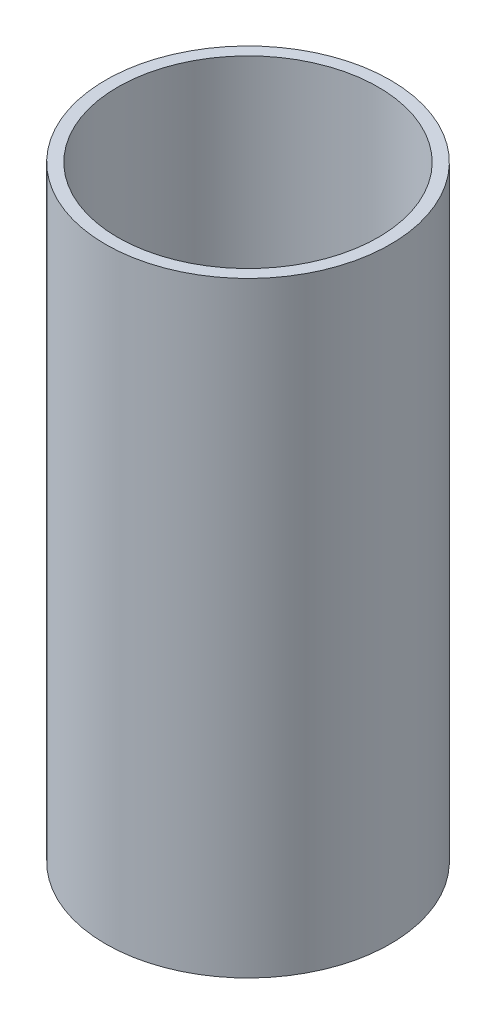
ISO-10303-21;
HEADER;
FILE_DESCRIPTION(('STEP AP214'),'2;1');
FILE_NAME('part.step','',(''),(''),'','','');
FILE_SCHEMA(('AUTOMOTIVE_DESIGN { 1 0 10303 214 1 1 1 1 }'));
ENDSEC;
DATA;
#1=APPLICATION_CONTEXT('core data for automotive mechanical design processes');
#2=APPLICATION_PROTOCOL_DEFINITION('international standard','automotive_design',2000,#1);
#3=PRODUCT_CONTEXT('',#1,'mechanical');
#4=PRODUCT('Part','Part','',(#3));
#5=PRODUCT_RELATED_PRODUCT_CATEGORY('part','',(#4));
#6=PRODUCT_DEFINITION_FORMATION('','',#4);
#7=PRODUCT_DEFINITION_CONTEXT('part definition',#1,'design');
#8=PRODUCT_DEFINITION('design','',#6,#7);
#9=PRODUCT_DEFINITION_SHAPE('','',#8);
#10=(LENGTH_UNIT() NAMED_UNIT(*) SI_UNIT(.MILLI.,.METRE.));
#11=(NAMED_UNIT(*) PLANE_ANGLE_UNIT() SI_UNIT($,.RADIAN.));
#12=(NAMED_UNIT(*) SI_UNIT($,.STERADIAN.) SOLID_ANGLE_UNIT());
#13=UNCERTAINTY_MEASURE_WITH_UNIT(LENGTH_MEASURE(1.E-05),#10,'distance_accuracy_value','');
#14=(GEOMETRIC_REPRESENTATION_CONTEXT(3) GLOBAL_UNCERTAINTY_ASSIGNED_CONTEXT((#13)) GLOBAL_UNIT_ASSIGNED_CONTEXT((#10,
#11,#12)) REPRESENTATION_CONTEXT('',''));
#15=CARTESIAN_POINT('',(0.,0.,0.));
#16=DIRECTION('',(0.,0.,1.));
#17=DIRECTION('',(1.,0.,0.));
#18=AXIS2_PLACEMENT_3D('',#15,#16,#17);
#19=CARTESIAN_POINT('',(0.,5.,0.));
#20=DIRECTION('',(0.,1.,0.));
#21=DIRECTION('',(0.,0.,1.));
#22=AXIS2_PLACEMENT_3D('',#19,#20,#21);
#23=PLANE('',#22);
#24=CARTESIAN_POINT('',(0.,5.,0.));
#25=DIRECTION('',(0.,1.,0.));
#26=DIRECTION('',(0.,0.,1.));
#27=AXIS2_PLACEMENT_3D('',#24,#25,#26);
#28=CIRCLE('',#27,2.35);
#29=CARTESIAN_POINT('',(0.,5.,2.35));
#30=VERTEX_POINT('',#29);
#31=EDGE_CURVE('E10',#30,#30,#28,.T.);
#32=ORIENTED_EDGE('',*,*,#31,.T.);
#33=EDGE_LOOP('',(#32));
#34=FACE_BOUND('',#33,.T.);
#35=CARTESIAN_POINT('',(0.,5.,0.));
#36=DIRECTION('',(0.,1.,0.));
#37=DIRECTION('',(0.,0.,1.));
#38=AXIS2_PLACEMENT_3D('',#35,#36,#37);
#39=CIRCLE('',#38,2.15);
#40=CARTESIAN_POINT('',(0.,5.,2.15));
#41=VERTEX_POINT('',#40);
#42=EDGE_CURVE('E50',#41,#41,#39,.T.);
#43=ORIENTED_EDGE('',*,*,#42,.F.);
#44=EDGE_LOOP('',(#43));
#45=FACE_BOUND('',#44,.T.);
#46=ADVANCED_FACE('F37',(#34,#45),#23,.T.);
#47=CARTESIAN_POINT('',(0.,-5.,0.));
#48=DIRECTION('',(0.,1.,0.));
#49=DIRECTION('',(0.,0.,1.));
#50=AXIS2_PLACEMENT_3D('',#47,#48,#49);
#51=PLANE('',#50);
#52=CARTESIAN_POINT('',(0.,-5.,0.));
#53=DIRECTION('',(0.,1.,0.));
#54=DIRECTION('',(0.,0.,1.));
#55=AXIS2_PLACEMENT_3D('',#52,#53,#54);
#56=CIRCLE('',#55,2.35);
#57=CARTESIAN_POINT('',(0.,-5.,2.35));
#58=VERTEX_POINT('',#57);
#59=EDGE_CURVE('E41',#58,#58,#56,.T.);
#60=ORIENTED_EDGE('',*,*,#59,.F.);
#61=EDGE_LOOP('',(#60));
#62=FACE_BOUND('',#61,.T.);
#63=CARTESIAN_POINT('',(0.,-5.,0.));
#64=DIRECTION('',(0.,1.,0.));
#65=DIRECTION('',(0.,0.,1.));
#66=AXIS2_PLACEMENT_3D('',#63,#64,#65);
#67=CIRCLE('',#66,2.15);
#68=CARTESIAN_POINT('',(0.,-5.,2.15));
#69=VERTEX_POINT('',#68);
#70=EDGE_CURVE('E52',#69,#69,#67,.T.);
#71=ORIENTED_EDGE('',*,*,#70,.T.);
#72=EDGE_LOOP('',(#71));
#73=FACE_BOUND('',#72,.T.);
#74=ADVANCED_FACE('F64',(#62,#73),#51,.F.);
#75=CARTESIAN_POINT('',(0.,5.,0.));
#76=DIRECTION('',(0.,-1.,0.));
#77=DIRECTION('',(0.,0.,-1.));
#78=AXIS2_PLACEMENT_3D('',#75,#76,#77);
#79=CYLINDRICAL_SURFACE('',#78,2.35);
#80=ORIENTED_EDGE('',*,*,#31,.F.);
#81=EDGE_LOOP('',(#80));
#82=FACE_BOUND('',#81,.T.);
#83=ORIENTED_EDGE('',*,*,#59,.T.);
#84=EDGE_LOOP('',(#83));
#85=FACE_BOUND('',#84,.T.);
#86=ADVANCED_FACE('F39',(#82,#85),#79,.T.);
#87=CARTESIAN_POINT('',(0.,5.,0.));
#88=DIRECTION('',(0.,-1.,0.));
#89=DIRECTION('',(0.,0.,-1.));
#90=AXIS2_PLACEMENT_3D('',#87,#88,#89);
#91=CYLINDRICAL_SURFACE('',#90,2.15);
#92=ORIENTED_EDGE('',*,*,#42,.T.);
#93=EDGE_LOOP('',(#92));
#94=FACE_BOUND('',#93,.T.);
#95=ORIENTED_EDGE('',*,*,#70,.F.);
#96=EDGE_LOOP('',(#95));
#97=FACE_BOUND('',#96,.T.);
#98=ADVANCED_FACE('F60',(#94,#97),#91,.F.);
#99=CLOSED_SHELL('',(#46,#74,#86,#98));
#100=MANIFOLD_SOLID_BREP('B2',#99);
#101=ADVANCED_BREP_SHAPE_REPRESENTATION('',(#18,#100),#14);
#102=SHAPE_DEFINITION_REPRESENTATION(#9,#101);
ENDSEC;
END-ISO-10303-21;
